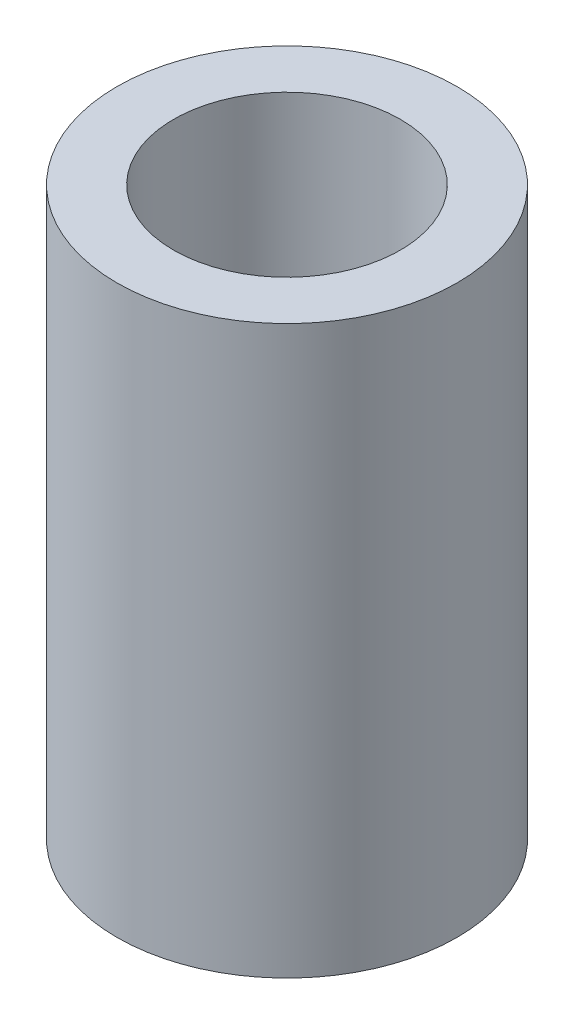
ISO-10303-21;
HEADER;
FILE_DESCRIPTION(('STEP AP214'),'2;1');
FILE_NAME('part.step','',(''),(''),'','','');
FILE_SCHEMA(('AUTOMOTIVE_DESIGN { 1 0 10303 214 1 1 1 1 }'));
ENDSEC;
DATA;
#1=APPLICATION_CONTEXT('core data for automotive mechanical design processes');
#2=APPLICATION_PROTOCOL_DEFINITION('international standard','automotive_design',2000,#1);
#3=PRODUCT_CONTEXT('',#1,'mechanical');
#4=PRODUCT('Part','Part','',(#3));
#5=PRODUCT_RELATED_PRODUCT_CATEGORY('part','',(#4));
#6=PRODUCT_DEFINITION_FORMATION('','',#4);
#7=PRODUCT_DEFINITION_CONTEXT('part definition',#1,'design');
#8=PRODUCT_DEFINITION('design','',#6,#7);
#9=PRODUCT_DEFINITION_SHAPE('','',#8);
#10=(LENGTH_UNIT() NAMED_UNIT(*) SI_UNIT(.MILLI.,.METRE.));
#11=(NAMED_UNIT(*) PLANE_ANGLE_UNIT() SI_UNIT($,.RADIAN.));
#12=(NAMED_UNIT(*) SI_UNIT($,.STERADIAN.) SOLID_ANGLE_UNIT());
#13=UNCERTAINTY_MEASURE_WITH_UNIT(LENGTH_MEASURE(1.E-05),#10,'distance_accuracy_value','');
#14=(GEOMETRIC_REPRESENTATION_CONTEXT(3) GLOBAL_UNCERTAINTY_ASSIGNED_CONTEXT((#13)) GLOBAL_UNIT_ASSIGNED_CONTEXT((#10,
#11,#12)) REPRESENTATION_CONTEXT('',''));
#15=CARTESIAN_POINT('',(0.,0.,0.));
#16=DIRECTION('',(0.,0.,1.));
#17=DIRECTION('',(1.,0.,0.));
#18=AXIS2_PLACEMENT_3D('',#15,#16,#17);
#19=CARTESIAN_POINT('',(110.,47.,0.));
#20=DIRECTION('',(0.,-1.,0.));
#21=DIRECTION('',(0.,0.,-1.));
#22=AXIS2_PLACEMENT_3D('',#19,#20,#21);
#23=CYLINDRICAL_SURFACE('',#22,2.99999999999999);
#24=CARTESIAN_POINT('',(110.,47.,0.));
#25=DIRECTION('',(0.,1.,0.));
#26=DIRECTION('',(0.,0.,1.));
#27=AXIS2_PLACEMENT_3D('',#24,#25,#26);
#28=CIRCLE('',#27,2.99999999999999);
#29=CARTESIAN_POINT('',(110.,47.,2.99999999999999));
#30=VERTEX_POINT('',#29);
#31=EDGE_CURVE('E10',#30,#30,#28,.T.);
#32=ORIENTED_EDGE('',*,*,#31,.F.);
#33=EDGE_LOOP('',(#32));
#34=FACE_BOUND('',#33,.T.);
#35=CARTESIAN_POINT('',(110.,37.,0.));
#36=DIRECTION('',(0.,1.,0.));
#37=DIRECTION('',(0.,0.,1.));
#38=AXIS2_PLACEMENT_3D('',#35,#36,#37);
#39=CIRCLE('',#38,2.99999999999999);
#40=CARTESIAN_POINT('',(110.,37.,2.99999999999999));
#41=VERTEX_POINT('',#40);
#42=EDGE_CURVE('E38',#41,#41,#39,.T.);
#43=ORIENTED_EDGE('',*,*,#42,.T.);
#44=EDGE_LOOP('',(#43));
#45=FACE_BOUND('',#44,.T.);
#46=ADVANCED_FACE('F35',(#34,#45),#23,.T.);
#47=CARTESIAN_POINT('',(110.,47.,0.));
#48=DIRECTION('',(0.,1.,0.));
#49=DIRECTION('',(0.,0.,1.));
#50=AXIS2_PLACEMENT_3D('',#47,#48,#49);
#51=PLANE('',#50);
#52=CARTESIAN_POINT('',(110.,47.,0.));
#53=DIRECTION('',(0.,1.,0.));
#54=DIRECTION('',(0.,0.,1.));
#55=AXIS2_PLACEMENT_3D('',#52,#53,#54);
#56=CIRCLE('',#55,2.);
#57=CARTESIAN_POINT('',(110.,47.,2.));
#58=VERTEX_POINT('',#57);
#59=EDGE_CURVE('E47',#58,#58,#56,.T.);
#60=ORIENTED_EDGE('',*,*,#59,.F.);
#61=EDGE_LOOP('',(#60));
#62=FACE_BOUND('',#61,.T.);
#63=ORIENTED_EDGE('',*,*,#31,.T.);
#64=EDGE_LOOP('',(#63));
#65=FACE_BOUND('',#64,.T.);
#66=ADVANCED_FACE('F62',(#62,#65),#51,.T.);
#67=CARTESIAN_POINT('',(110.,37.,0.));
#68=DIRECTION('',(0.,1.,0.));
#69=DIRECTION('',(0.,0.,1.));
#70=AXIS2_PLACEMENT_3D('',#67,#68,#69);
#71=PLANE('',#70);
#72=CARTESIAN_POINT('',(110.,37.,0.));
#73=DIRECTION('',(0.,1.,0.));
#74=DIRECTION('',(0.,0.,1.));
#75=AXIS2_PLACEMENT_3D('',#72,#73,#74);
#76=CIRCLE('',#75,2.);
#77=CARTESIAN_POINT('',(110.,37.,2.));
#78=VERTEX_POINT('',#77);
#79=EDGE_CURVE('E45',#78,#78,#76,.T.);
#80=ORIENTED_EDGE('',*,*,#79,.T.);
#81=EDGE_LOOP('',(#80));
#82=FACE_BOUND('',#81,.T.);
#83=ORIENTED_EDGE('',*,*,#42,.F.);
#84=EDGE_LOOP('',(#83));
#85=FACE_BOUND('',#84,.T.);
#86=ADVANCED_FACE('F53',(#82,#85),#71,.F.);
#87=CARTESIAN_POINT('',(110.,37.,0.));
#88=DIRECTION('',(0.,1.,0.));
#89=DIRECTION('',(0.,0.,1.));
#90=AXIS2_PLACEMENT_3D('',#87,#88,#89);
#91=CYLINDRICAL_SURFACE('',#90,2.);
#92=ORIENTED_EDGE('',*,*,#79,.F.);
#93=EDGE_LOOP('',(#92));
#94=FACE_BOUND('',#93,.T.);
#95=ORIENTED_EDGE('',*,*,#59,.T.);
#96=EDGE_LOOP('',(#95));
#97=FACE_BOUND('',#96,.T.);
#98=ADVANCED_FACE('F56',(#94,#97),#91,.F.);
#99=CLOSED_SHELL('',(#46,#66,#86,#98));
#100=MANIFOLD_SOLID_BREP('B2',#99);
#101=ADVANCED_BREP_SHAPE_REPRESENTATION('',(#18,#100),#14);
#102=SHAPE_DEFINITION_REPRESENTATION(#9,#101);
ENDSEC;
END-ISO-10303-21;
